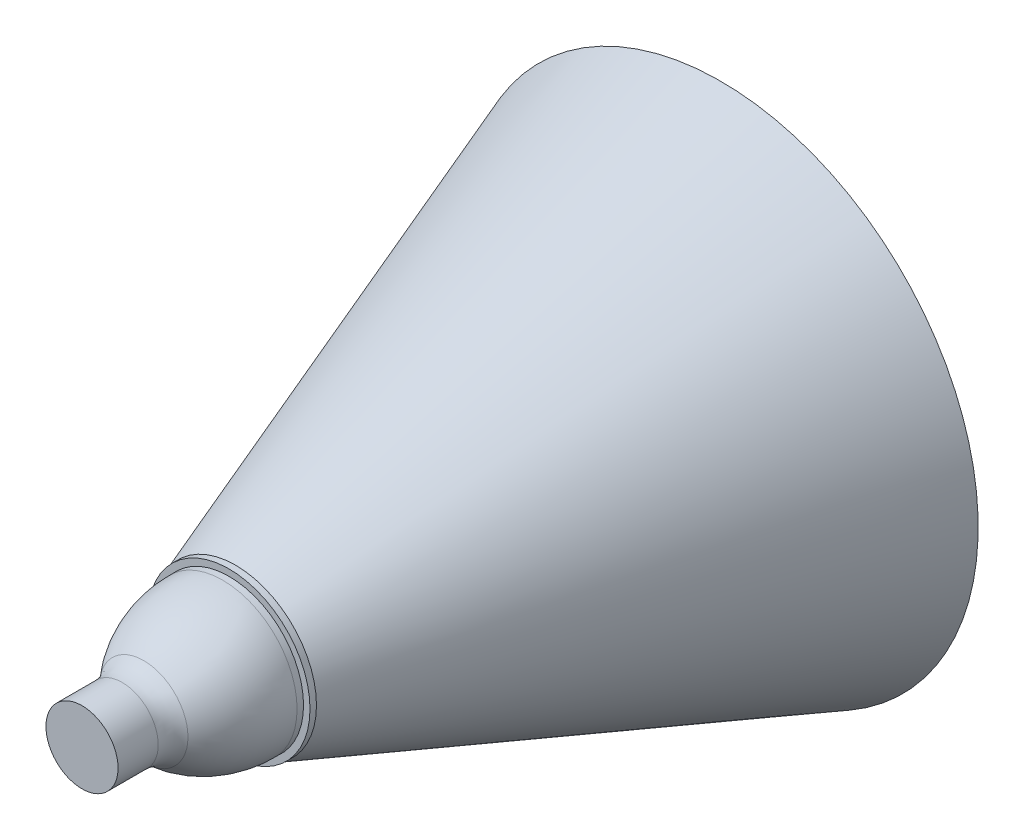
ISO-10303-21;
HEADER;
FILE_DESCRIPTION(('STEP AP214'),'2;1');
FILE_NAME('part.step','',(''),(''),'','','');
FILE_SCHEMA(('AUTOMOTIVE_DESIGN { 1 0 10303 214 1 1 1 1 }'));
ENDSEC;
DATA;
#1=APPLICATION_CONTEXT('core data for automotive mechanical design processes');
#2=APPLICATION_PROTOCOL_DEFINITION('international standard','automotive_design',2000,#1);
#3=PRODUCT_CONTEXT('',#1,'mechanical');
#4=PRODUCT('Part','Part','',(#3));
#5=PRODUCT_RELATED_PRODUCT_CATEGORY('part','',(#4));
#6=PRODUCT_DEFINITION_FORMATION('','',#4);
#7=PRODUCT_DEFINITION_CONTEXT('part definition',#1,'design');
#8=PRODUCT_DEFINITION('design','',#6,#7);
#9=PRODUCT_DEFINITION_SHAPE('','',#8);
#10=(LENGTH_UNIT() NAMED_UNIT(*) SI_UNIT(.MILLI.,.METRE.));
#11=(NAMED_UNIT(*) PLANE_ANGLE_UNIT() SI_UNIT($,.RADIAN.));
#12=(NAMED_UNIT(*) SI_UNIT($,.STERADIAN.) SOLID_ANGLE_UNIT());
#13=UNCERTAINTY_MEASURE_WITH_UNIT(LENGTH_MEASURE(1.E-05),#10,'distance_accuracy_value','');
#14=(GEOMETRIC_REPRESENTATION_CONTEXT(3) GLOBAL_UNCERTAINTY_ASSIGNED_CONTEXT((#13)) GLOBAL_UNIT_ASSIGNED_CONTEXT((#10,
#11,#12)) REPRESENTATION_CONTEXT('',''));
#15=CARTESIAN_POINT('',(0.,0.,0.));
#16=DIRECTION('',(0.,0.,1.));
#17=DIRECTION('',(1.,0.,0.));
#18=AXIS2_PLACEMENT_3D('',#15,#16,#17);
#19=CARTESIAN_POINT('',(0.,-11.15,47.5));
#20=DIRECTION('',(0.,0.,1.));
#21=DIRECTION('',(1.,0.,0.));
#22=AXIS2_PLACEMENT_3D('',#19,#20,#21);
#23=PLANE('',#22);
#24=CARTESIAN_POINT('',(0.,0.,47.5));
#25=DIRECTION('',(0.,0.,1.));
#26=DIRECTION('',(1.,0.,0.));
#27=AXIS2_PLACEMENT_3D('',#24,#25,#26);
#28=CIRCLE('',#27,11.15);
#29=CARTESIAN_POINT('',(11.15,0.,47.5));
#30=VERTEX_POINT('',#29);
#31=EDGE_CURVE('E55',#30,#30,#28,.T.);
#32=ORIENTED_EDGE('',*,*,#31,.T.);
#33=EDGE_LOOP('',(#32));
#34=FACE_BOUND('',#33,.T.);
#35=ADVANCED_FACE('F41',(#34),#23,.T.);
#36=CARTESIAN_POINT('',(0.,0.,47.5));
#37=DIRECTION('',(0.,0.,1.));
#38=DIRECTION('',(1.,0.,0.));
#39=AXIS2_PLACEMENT_3D('',#36,#37,#38);
#40=CYLINDRICAL_SURFACE('',#39,11.15);
#41=CARTESIAN_POINT('',(0.,0.,35.0805405358401));
#42=DIRECTION('',(0.,0.,1.));
#43=DIRECTION('',(1.,0.,0.));
#44=AXIS2_PLACEMENT_3D('',#41,#42,#43);
#45=CIRCLE('',#44,11.15);
#46=CARTESIAN_POINT('',(11.15,0.,35.0805405358401));
#47=VERTEX_POINT('',#46);
#48=EDGE_CURVE('E48',#47,#47,#45,.T.);
#49=ORIENTED_EDGE('',*,*,#48,.T.);
#50=EDGE_LOOP('',(#49));
#51=FACE_BOUND('',#50,.T.);
#52=ORIENTED_EDGE('',*,*,#31,.F.);
#53=EDGE_LOOP('',(#52));
#54=FACE_BOUND('',#53,.T.);
#55=ADVANCED_FACE('F83',(#51,#54),#40,.T.);
#56=CARTESIAN_POINT('',(0.,0.,4.));
#57=DIRECTION('',(0.,0.,1.));
#58=DIRECTION('',(1.,0.,0.));
#59=AXIS2_PLACEMENT_3D('',#56,#57,#58);
#60=DEGENERATE_TOROIDAL_SURFACE('',#59,13.6844936708861,36.6844936708861,.F.);
#61=CARTESIAN_POINT('',(0.,0.,28.4229679476163));
#62=DIRECTION('',(0.,0.,-1.));
#63=DIRECTION('',(-1.,0.,0.));
#64=AXIS2_PLACEMENT_3D('',#61,#62,#63);
#65=CIRCLE('',#64,13.6883160591908);
#66=CARTESIAN_POINT('',(-13.6883160591908,0.,28.4229679476163));
#67=VERTEX_POINT('',#66);
#68=EDGE_CURVE('E10',#67,#67,#65,.T.);
#69=ORIENTED_EDGE('',*,*,#68,.T.);
#70=EDGE_LOOP('',(#69));
#71=FACE_BOUND('',#70,.T.);
#72=CARTESIAN_POINT('',(0.,0.,4.));
#73=DIRECTION('',(0.,0.,1.));
#74=DIRECTION('',(1.,0.,0.));
#75=AXIS2_PLACEMENT_3D('',#72,#73,#74);
#76=CIRCLE('',#75,23.);
#77=CARTESIAN_POINT('',(23.,0.,4.));
#78=VERTEX_POINT('',#77);
#79=EDGE_CURVE('E57',#78,#78,#76,.T.);
#80=ORIENTED_EDGE('',*,*,#79,.T.);
#81=EDGE_LOOP('',(#80));
#82=FACE_BOUND('',#81,.T.);
#83=ADVANCED_FACE('F93',(#71,#82),#60,.F.);
#84=CARTESIAN_POINT('',(0.,0.,47.5));
#85=DIRECTION('',(0.,0.,1.));
#86=DIRECTION('',(1.,0.,0.));
#87=AXIS2_PLACEMENT_3D('',#84,#85,#86);
#88=CYLINDRICAL_SURFACE('',#87,23.);
#89=CARTESIAN_POINT('',(0.,0.,1.99999999999999));
#90=DIRECTION('',(0.,0.,1.));
#91=DIRECTION('',(1.,0.,0.));
#92=AXIS2_PLACEMENT_3D('',#89,#90,#91);
#93=CIRCLE('',#92,23.);
#94=CARTESIAN_POINT('',(23.,0.,1.99999999999999));
#95=VERTEX_POINT('',#94);
#96=EDGE_CURVE('E62',#95,#95,#93,.T.);
#97=ORIENTED_EDGE('',*,*,#96,.T.);
#98=EDGE_LOOP('',(#97));
#99=FACE_BOUND('',#98,.T.);
#100=ORIENTED_EDGE('',*,*,#79,.F.);
#101=EDGE_LOOP('',(#100));
#102=FACE_BOUND('',#101,.T.);
#103=ADVANCED_FACE('F96',(#99,#102),#88,.T.);
#104=CARTESIAN_POINT('',(0.,-25.,2.));
#105=DIRECTION('',(0.,0.,1.));
#106=DIRECTION('',(1.,0.,0.));
#107=AXIS2_PLACEMENT_3D('',#104,#105,#106);
#108=PLANE('',#107);
#109=CARTESIAN_POINT('',(0.,0.,1.99999999999999));
#110=DIRECTION('',(0.,0.,1.));
#111=DIRECTION('',(1.,0.,0.));
#112=AXIS2_PLACEMENT_3D('',#109,#110,#111);
#113=CIRCLE('',#112,25.);
#114=CARTESIAN_POINT('',(25.,0.,1.99999999999999));
#115=VERTEX_POINT('',#114);
#116=EDGE_CURVE('E61',#115,#115,#113,.T.);
#117=ORIENTED_EDGE('',*,*,#116,.T.);
#118=EDGE_LOOP('',(#117));
#119=FACE_BOUND('',#118,.T.);
#120=ORIENTED_EDGE('',*,*,#96,.F.);
#121=EDGE_LOOP('',(#120));
#122=FACE_BOUND('',#121,.T.);
#123=ADVANCED_FACE('F98',(#119,#122),#108,.T.);
#124=CARTESIAN_POINT('',(0.,0.,47.5));
#125=DIRECTION('',(0.,0.,1.));
#126=DIRECTION('',(1.,0.,0.));
#127=AXIS2_PLACEMENT_3D('',#124,#125,#126);
#128=CYLINDRICAL_SURFACE('',#127,25.);
#129=CARTESIAN_POINT('',(0.,0.,0.));
#130=DIRECTION('',(0.,0.,1.));
#131=DIRECTION('',(1.,0.,0.));
#132=AXIS2_PLACEMENT_3D('',#129,#130,#131);
#133=CIRCLE('',#132,25.);
#134=CARTESIAN_POINT('',(-25.,0.,0.));
#135=VERTEX_POINT('',#134);
#136=EDGE_CURVE('E69',#135,#135,#133,.T.);
#137=ORIENTED_EDGE('',*,*,#136,.T.);
#138=EDGE_LOOP('',(#137));
#139=FACE_BOUND('',#138,.T.);
#140=ORIENTED_EDGE('',*,*,#116,.F.);
#141=EDGE_LOOP('',(#140));
#142=FACE_BOUND('',#141,.T.);
#143=ADVANCED_FACE('F105',(#139,#142),#128,.T.);
#144=CARTESIAN_POINT('',(0.,0.,35.0805405358401));
#145=DIRECTION('',(0.,0.,1.));
#146=DIRECTION('',(1.,0.,0.));
#147=AXIS2_PLACEMENT_3D('',#144,#145,#146);
#148=TOROIDAL_SURFACE('',#147,21.15,10.);
#149=ORIENTED_EDGE('',*,*,#68,.F.);
#150=EDGE_LOOP('',(#149));
#151=FACE_BOUND('',#150,.T.);
#152=ORIENTED_EDGE('',*,*,#48,.F.);
#153=EDGE_LOOP('',(#152));
#154=FACE_BOUND('',#153,.T.);
#155=ADVANCED_FACE('F43',(#151,#154),#148,.F.);
#156=CARTESIAN_POINT('',(0.,0.,0.));
#157=DIRECTION('',(0.,0.,-1.));
#158=DIRECTION('',(-1.,0.,0.));
#159=AXIS2_PLACEMENT_3D('',#156,#157,#158);
#160=CONICAL_SURFACE('',#159,25.,0.349065850398859);
#161=CARTESIAN_POINT('',(0.,0.,-150.));
#162=DIRECTION('',(0.,0.,1.));
#163=DIRECTION('',(1.,0.,0.));
#164=AXIS2_PLACEMENT_3D('',#161,#162,#163);
#165=CIRCLE('',#164,79.5955351399292);
#166=CARTESIAN_POINT('',(-79.5955351399292,0.,-150.));
#167=VERTEX_POINT('',#166);
#168=EDGE_CURVE('E68',#167,#167,#165,.T.);
#169=CARTESIAN_POINT('',(-79.5955351399292,0.,-150.));
#170=CARTESIAN_POINT('',(-79.0268316488883,0.,-148.4375));
#171=CARTESIAN_POINT('',(-78.4581281578474,0.,-146.875));
#172=CARTESIAN_POINT('',(-77.3207211757655,0.,-143.75));
#173=CARTESIAN_POINT('',(-76.7520176847246,0.,-142.1875));
#174=CARTESIAN_POINT('',(-75.6146107026427,0.,-139.0625));
#175=CARTESIAN_POINT('',(-75.0459072116018,0.,-137.5));
#176=CARTESIAN_POINT('',(-73.9085002295199,0.,-134.375));
#177=CARTESIAN_POINT('',(-73.339796738479,0.,-132.8125));
#178=CARTESIAN_POINT('',(-72.2023897563971,0.,-129.6875));
#179=CARTESIAN_POINT('',(-71.6336862653562,0.,-128.125));
#180=CARTESIAN_POINT('',(-70.4962792832743,0.,-125.));
#181=CARTESIAN_POINT('',(-69.9275757922334,0.,-123.4375));
#182=CARTESIAN_POINT('',(-68.7901688101515,0.,-120.3125));
#183=CARTESIAN_POINT('',(-68.2214653191106,0.,-118.75));
#184=CARTESIAN_POINT('',(-67.0840583370288,0.,-115.625));
#185=CARTESIAN_POINT('',(-66.5153548459878,0.,-114.0625));
#186=CARTESIAN_POINT('',(-65.377947863906,0.,-110.9375));
#187=CARTESIAN_POINT('',(-64.8092443728651,0.,-109.375));
#188=CARTESIAN_POINT('',(-63.6718373907832,0.,-106.25));
#189=CARTESIAN_POINT('',(-63.1031338997423,0.,-104.6875));
#190=CARTESIAN_POINT('',(-61.9657269176604,0.,-101.5625));
#191=CARTESIAN_POINT('',(-61.3970234266195,0.,-100.));
#192=CARTESIAN_POINT('',(-60.2596164445376,0.,-96.875));
#193=CARTESIAN_POINT('',(-59.6909129534967,0.,-95.3125));
#194=CARTESIAN_POINT('',(-58.5535059714148,0.,-92.1875));
#195=CARTESIAN_POINT('',(-57.9848024803739,0.,-90.625));
#196=CARTESIAN_POINT('',(-56.847395498292,0.,-87.5));
#197=CARTESIAN_POINT('',(-56.2786920072511,0.,-85.9375));
#198=CARTESIAN_POINT('',(-55.1412850251692,0.,-82.8125));
#199=CARTESIAN_POINT('',(-54.5725815341283,0.,-81.25));
#200=CARTESIAN_POINT('',(-53.4351745520465,0.,-78.125));
#201=CARTESIAN_POINT('',(-52.8664710610055,0.,-76.5625));
#202=CARTESIAN_POINT('',(-51.7290640789237,0.,-73.4375));
#203=CARTESIAN_POINT('',(-51.1603605878827,0.,-71.875));
#204=CARTESIAN_POINT('',(-50.0229536058009,0.,-68.75));
#205=CARTESIAN_POINT('',(-49.45425011476,0.,-67.1875));
#206=CARTESIAN_POINT('',(-48.3168431326781,0.,-64.0625));
#207=CARTESIAN_POINT('',(-47.7481396416372,0.,-62.5));
#208=CARTESIAN_POINT('',(-46.6107326595553,0.,-59.375));
#209=CARTESIAN_POINT('',(-46.0420291685144,0.,-57.8125));
#210=CARTESIAN_POINT('',(-44.9046221864325,0.,-54.6875));
#211=CARTESIAN_POINT('',(-44.3359186953916,0.,-53.125));
#212=CARTESIAN_POINT('',(-43.1985117133097,0.,-50.));
#213=CARTESIAN_POINT('',(-42.6298082222688,0.,-48.4375));
#214=CARTESIAN_POINT('',(-41.4924012401869,0.,-45.3125));
#215=CARTESIAN_POINT('',(-40.923697749146,0.,-43.75));
#216=CARTESIAN_POINT('',(-39.7862907670642,0.,-40.625));
#217=CARTESIAN_POINT('',(-39.2175872760232,0.,-39.0625));
#218=CARTESIAN_POINT('',(-38.0801802939414,0.,-35.9375));
#219=CARTESIAN_POINT('',(-37.5114768029004,0.,-34.375));
#220=CARTESIAN_POINT('',(-36.3740698208186,0.,-31.25));
#221=CARTESIAN_POINT('',(-35.8053663297777,0.,-29.6875));
#222=CARTESIAN_POINT('',(-34.6679593476958,0.,-26.5625));
#223=CARTESIAN_POINT('',(-34.0992558566549,0.,-25.));
#224=CARTESIAN_POINT('',(-32.961848874573,0.,-21.875));
#225=CARTESIAN_POINT('',(-32.3931453835321,0.,-20.3125));
#226=CARTESIAN_POINT('',(-31.2557384014502,0.,-17.1875));
#227=CARTESIAN_POINT('',(-30.6870349104093,0.,-15.625));
#228=CARTESIAN_POINT('',(-29.5496279283274,0.,-12.5));
#229=CARTESIAN_POINT('',(-28.9809244372865,0.,-10.9375));
#230=CARTESIAN_POINT('',(-27.8435174552046,0.,-7.8125));
#231=CARTESIAN_POINT('',(-27.2748139641637,0.,-6.25000000000001));
#232=CARTESIAN_POINT('',(-26.1374069820819,0.,-3.12500000000001));
#233=CARTESIAN_POINT('',(-25.5687034910409,0.,-1.5625));
#234=CARTESIAN_POINT('',(-25.,0.,0.));
#235=B_SPLINE_CURVE_WITH_KNOTS('',3,(#169,#170,#171,#172,#173,#174,#175,#176,#177,#178,#179,
#180,#181,#182,#183,#184,#185,#186,#187,#188,#189,#190,#191,#192,#193,#194,#195,#196,#197,#198,
#199,#200,#201,#202,#203,#204,#205,#206,#207,#208,#209,#210,#211,#212,#213,#214,#215,#216,#217,
#218,#219,#220,#221,#222,#223,#224,#225,#226,#227,#228,#229,#230,#231,#232,#233,#234),
.UNSPECIFIED.,.F.,.F.,(4,2,2,2,2,2,2,2,2,2,2,2,2,2,2,2,2,2,2,2,2,2,2,2,2,2,2,2,2,2,2,2,4),(0.,
4.98833330848084,9.97666661696165,14.9649999254425,19.9533332339233,24.9416665424041,
29.929999850885,34.9183331593658,39.9066664678466,44.8949997763274,49.8833330848082,
54.8716663932891,59.8599997017699,64.8483330102507,69.8366663187316,74.8249996272124,
79.8133329356932,84.801666244174,89.7899995526548,94.7783328611357,99.7666661696165,
104.754999478097,109.743332786578,114.731666095059,119.71999940354,124.708332712021,
129.696666020501,134.684999328982,139.673332637463,144.661665945944,149.649999254425,
154.638332562906,159.626665871386),.UNSPECIFIED.);
#236=EDGE_CURVE('BSEAM74',#167,#135,#235,.T.);
#237=ORIENTED_EDGE('',*,*,#168,.T.);
#238=ORIENTED_EDGE('',*,*,#136,.F.);
#239=ORIENTED_EDGE('',*,*,#236,.T.);
#240=ORIENTED_EDGE('',*,*,#236,.F.);
#241=EDGE_LOOP('',(#237,#239,#238,#240));
#242=FACE_BOUND('',#241,.T.);
#243=ADVANCED_FACE('F74',(#242),#160,.T.);
#244=CARTESIAN_POINT('',(0.,-79.5955351399292,-150.));
#245=DIRECTION('',(0.,0.,-1.));
#246=DIRECTION('',(-1.,0.,0.));
#247=AXIS2_PLACEMENT_3D('',#244,#245,#246);
#248=PLANE('',#247);
#249=ORIENTED_EDGE('',*,*,#168,.F.);
#250=EDGE_LOOP('',(#249));
#251=FACE_BOUND('',#250,.T.);
#252=ADVANCED_FACE('F80',(#251),#248,.T.);
#253=CLOSED_SHELL('',(#35,#55,#83,#103,#123,#143,#155,#243,#252));
#254=MANIFOLD_SOLID_BREP('B2',#253);
#255=ADVANCED_BREP_SHAPE_REPRESENTATION('',(#18,#254),#14);
#256=SHAPE_DEFINITION_REPRESENTATION(#9,#255);
ENDSEC;
END-ISO-10303-21;
